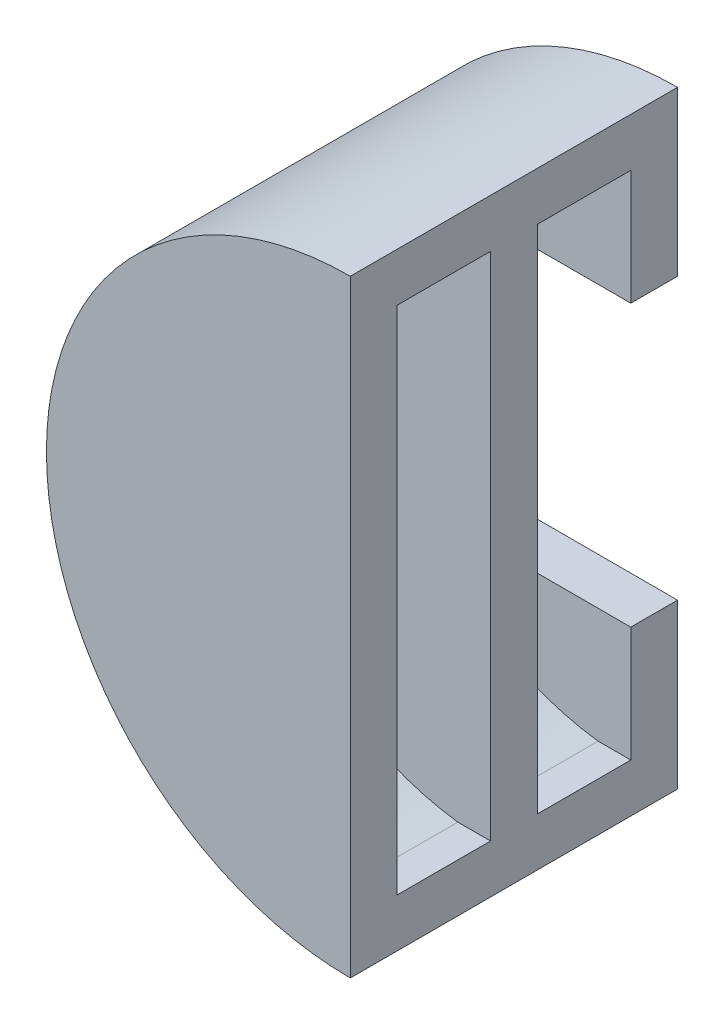
ISO-10303-21;
HEADER;
FILE_DESCRIPTION(('STEP AP214'),'2;1');
FILE_NAME('part.step','',(''),(''),'','','');
FILE_SCHEMA(('AUTOMOTIVE_DESIGN { 1 0 10303 214 1 1 1 1 }'));
ENDSEC;
DATA;
#1=APPLICATION_CONTEXT('core data for automotive mechanical design processes');
#2=APPLICATION_PROTOCOL_DEFINITION('international standard','automotive_design',2000,#1);
#3=PRODUCT_CONTEXT('',#1,'mechanical');
#4=PRODUCT('Part','Part','',(#3));
#5=PRODUCT_RELATED_PRODUCT_CATEGORY('part','',(#4));
#6=PRODUCT_DEFINITION_FORMATION('','',#4);
#7=PRODUCT_DEFINITION_CONTEXT('part definition',#1,'design');
#8=PRODUCT_DEFINITION('design','',#6,#7);
#9=PRODUCT_DEFINITION_SHAPE('','',#8);
#10=(LENGTH_UNIT() NAMED_UNIT(*) SI_UNIT(.MILLI.,.METRE.));
#11=(NAMED_UNIT(*) PLANE_ANGLE_UNIT() SI_UNIT($,.RADIAN.));
#12=(NAMED_UNIT(*) SI_UNIT($,.STERADIAN.) SOLID_ANGLE_UNIT());
#13=UNCERTAINTY_MEASURE_WITH_UNIT(LENGTH_MEASURE(1.E-05),#10,'distance_accuracy_value','');
#14=(GEOMETRIC_REPRESENTATION_CONTEXT(3) GLOBAL_UNCERTAINTY_ASSIGNED_CONTEXT((#13)) GLOBAL_UNIT_ASSIGNED_CONTEXT((#10,
#11,#12)) REPRESENTATION_CONTEXT('',''));
#15=CARTESIAN_POINT('',(0.,0.,0.));
#16=DIRECTION('',(0.,0.,1.));
#17=DIRECTION('',(1.,0.,0.));
#18=AXIS2_PLACEMENT_3D('',#15,#16,#17);
#19=CARTESIAN_POINT('',(0.,0.,35.));
#20=DIRECTION('',(0.,0.,-1.));
#21=DIRECTION('',(-1.,0.,0.));
#22=AXIS2_PLACEMENT_3D('',#19,#20,#21);
#23=CYLINDRICAL_SURFACE('',#22,32.5);
#24=CARTESIAN_POINT('',(0.,0.,0.));
#25=DIRECTION('',(0.,0.,-1.));
#26=DIRECTION('',(-1.,0.,0.));
#27=AXIS2_PLACEMENT_3D('',#24,#25,#26);
#28=CIRCLE('',#27,32.5);
#29=CARTESIAN_POINT('',(0.,-32.5,0.));
#30=VERTEX_POINT('',#29);
#31=CARTESIAN_POINT('',(0.,32.5,0.));
#32=VERTEX_POINT('',#31);
#33=EDGE_CURVE('E168',#30,#32,#28,.T.);
#34=ORIENTED_EDGE('',*,*,#33,.F.);
#35=DIRECTION('',(0.,0.,-1.));
#36=VECTOR('',#35,1.);
#37=CARTESIAN_POINT('',(0.,-32.5,100.094162564703));
#38=LINE('',#37,#36);
#39=CARTESIAN_POINT('',(0.,-32.5,35.));
#40=VERTEX_POINT('',#39);
#41=EDGE_CURVE('E213',#40,#30,#38,.T.);
#42=ORIENTED_EDGE('',*,*,#41,.F.);
#43=CARTESIAN_POINT('',(0.,0.,35.));
#44=DIRECTION('',(0.,0.,1.));
#45=DIRECTION('',(1.,0.,0.));
#46=AXIS2_PLACEMENT_3D('',#43,#44,#45);
#47=CIRCLE('',#46,32.5);
#48=CARTESIAN_POINT('',(0.,32.5,35.));
#49=VERTEX_POINT('',#48);
#50=EDGE_CURVE('E11',#49,#40,#47,.T.);
#51=ORIENTED_EDGE('',*,*,#50,.F.);
#52=DIRECTION('',(0.,0.,-1.));
#53=VECTOR('',#52,1.);
#54=CARTESIAN_POINT('',(0.,32.5,100.094162564703));
#55=LINE('',#54,#53);
#56=EDGE_CURVE('E205',#49,#32,#55,.T.);
#57=ORIENTED_EDGE('',*,*,#56,.T.);
#58=EDGE_LOOP('',(#34,#42,#51,#57));
#59=FACE_BOUND('',#58,.T.);
#60=ADVANCED_FACE('F34',(#59),#23,.T.);
#61=CARTESIAN_POINT('',(0.,32.5,100.094162564703));
#62=DIRECTION('',(-1.,0.,0.));
#63=DIRECTION('',(0.,0.,1.));
#64=AXIS2_PLACEMENT_3D('',#61,#62,#63);
#65=PLANE('',#64);
#66=DIRECTION('',(0.,0.,-1.));
#67=VECTOR('',#66,1.);
#68=CARTESIAN_POINT('',(0.,-27.310988842807,100.094162564703));
#69=LINE('',#68,#67);
#70=CARTESIAN_POINT('',(0.,-27.310988842807,30.));
#71=VERTEX_POINT('',#70);
#72=CARTESIAN_POINT('',(0.,-27.310988842807,20.));
#73=VERTEX_POINT('',#72);
#74=EDGE_CURVE('E203',#71,#73,#69,.T.);
#75=ORIENTED_EDGE('',*,*,#74,.F.);
#76=DIRECTION('',(0.,-1.,0.));
#77=VECTOR('',#76,1.);
#78=CARTESIAN_POINT('',(0.,32.5,30.));
#79=LINE('',#78,#77);
#80=CARTESIAN_POINT('',(0.,27.310988842807,30.));
#81=VERTEX_POINT('',#80);
#82=EDGE_CURVE('E196',#81,#71,#79,.T.);
#83=ORIENTED_EDGE('',*,*,#82,.F.);
#84=DIRECTION('',(0.,0.,1.));
#85=VECTOR('',#84,1.);
#86=CARTESIAN_POINT('',(0.,27.310988842807,100.094162564703));
#87=LINE('',#86,#85);
#88=CARTESIAN_POINT('',(0.,27.310988842807,20.));
#89=VERTEX_POINT('',#88);
#90=EDGE_CURVE('E198',#89,#81,#87,.T.);
#91=ORIENTED_EDGE('',*,*,#90,.F.);
#92=DIRECTION('',(0.,1.,0.));
#93=VECTOR('',#92,1.);
#94=CARTESIAN_POINT('',(0.,32.5,20.));
#95=LINE('',#94,#93);
#96=EDGE_CURVE('E201',#73,#89,#95,.T.);
#97=ORIENTED_EDGE('',*,*,#96,.F.);
#98=EDGE_LOOP('',(#75,#83,#91,#97));
#99=FACE_BOUND('',#98,.T.);
#100=DIRECTION('',(0.,1.,0.));
#101=VECTOR('',#100,1.);
#102=CARTESIAN_POINT('',(0.,32.5,5.));
#103=LINE('',#102,#101);
#104=CARTESIAN_POINT('',(0.,15.,5.));
#105=VERTEX_POINT('',#104);
#106=CARTESIAN_POINT('',(0.,27.310988842807,5.));
#107=VERTEX_POINT('',#106);
#108=EDGE_CURVE('E180',#105,#107,#103,.T.);
#109=ORIENTED_EDGE('',*,*,#108,.F.);
#110=DIRECTION('',(0.,0.,-1.));
#111=VECTOR('',#110,1.);
#112=CARTESIAN_POINT('',(0.,15.,8.));
#113=LINE('',#112,#111);
#114=CARTESIAN_POINT('',(0.,15.,0.));
#115=VERTEX_POINT('',#114);
#116=EDGE_CURVE('E157',#105,#115,#113,.T.);
#117=ORIENTED_EDGE('',*,*,#116,.T.);
#118=DIRECTION('',(0.,1.,0.));
#119=VECTOR('',#118,1.);
#120=CARTESIAN_POINT('',(0.,32.5,0.));
#121=LINE('',#120,#119);
#122=EDGE_CURVE('E209',#115,#32,#121,.T.);
#123=ORIENTED_EDGE('',*,*,#122,.T.);
#124=ORIENTED_EDGE('',*,*,#56,.F.);
#125=DIRECTION('',(0.,1.,0.));
#126=VECTOR('',#125,1.);
#127=CARTESIAN_POINT('',(0.,32.5,35.));
#128=LINE('',#127,#126);
#129=EDGE_CURVE('E208',#40,#49,#128,.T.);
#130=ORIENTED_EDGE('',*,*,#129,.F.);
#131=ORIENTED_EDGE('',*,*,#41,.T.);
#132=CARTESIAN_POINT('',(0.,-15.,0.));
#133=VERTEX_POINT('',#132);
#134=EDGE_CURVE('E206',#30,#133,#121,.T.);
#135=ORIENTED_EDGE('',*,*,#134,.T.);
#136=DIRECTION('',(0.,0.,-1.));
#137=VECTOR('',#136,1.);
#138=CARTESIAN_POINT('',(0.,-15.,8.));
#139=LINE('',#138,#137);
#140=CARTESIAN_POINT('',(0.,-15.,5.));
#141=VERTEX_POINT('',#140);
#142=EDGE_CURVE('E48',#141,#133,#139,.T.);
#143=ORIENTED_EDGE('',*,*,#142,.F.);
#144=CARTESIAN_POINT('',(0.,-27.310988842807,5.00000000000001));
#145=VERTEX_POINT('',#144);
#146=EDGE_CURVE('E188',#145,#141,#103,.T.);
#147=ORIENTED_EDGE('',*,*,#146,.F.);
#148=DIRECTION('',(0.,0.,-1.));
#149=VECTOR('',#148,1.);
#150=CARTESIAN_POINT('',(0.,-27.310988842807,100.094162564703));
#151=LINE('',#150,#149);
#152=CARTESIAN_POINT('',(0.,-27.310988842807,15.));
#153=VERTEX_POINT('',#152);
#154=EDGE_CURVE('E190',#153,#145,#151,.T.);
#155=ORIENTED_EDGE('',*,*,#154,.F.);
#156=DIRECTION('',(0.,-1.,0.));
#157=VECTOR('',#156,1.);
#158=CARTESIAN_POINT('',(0.,32.5,15.));
#159=LINE('',#158,#157);
#160=CARTESIAN_POINT('',(0.,27.310988842807,15.));
#161=VERTEX_POINT('',#160);
#162=EDGE_CURVE('E192',#161,#153,#159,.T.);
#163=ORIENTED_EDGE('',*,*,#162,.F.);
#164=DIRECTION('',(0.,0.,1.));
#165=VECTOR('',#164,1.);
#166=CARTESIAN_POINT('',(0.,27.310988842807,100.094162564703));
#167=LINE('',#166,#165);
#168=EDGE_CURVE('E194',#107,#161,#167,.T.);
#169=ORIENTED_EDGE('',*,*,#168,.F.);
#170=EDGE_LOOP('',(#109,#117,#123,#124,#130,#131,#135,#143,#147,#155,#163,#169));
#171=FACE_BOUND('',#170,.T.);
#172=ADVANCED_FACE('F251',(#99,#171),#65,.F.);
#173=CARTESIAN_POINT('',(0.,0.,35.));
#174=DIRECTION('',(0.,0.,1.));
#175=DIRECTION('',(1.,0.,0.));
#176=AXIS2_PLACEMENT_3D('',#173,#174,#175);
#177=PLANE('',#176);
#178=ORIENTED_EDGE('',*,*,#50,.T.);
#179=ORIENTED_EDGE('',*,*,#129,.T.);
#180=EDGE_LOOP('',(#178,#179));
#181=FACE_BOUND('',#180,.T.);
#182=ADVANCED_FACE('F266',(#181),#177,.T.);
#183=CARTESIAN_POINT('',(8.,27.310988842807,5.));
#184=DIRECTION('',(0.,-1.,0.));
#185=DIRECTION('',(0.,0.,-1.));
#186=AXIS2_PLACEMENT_3D('',#183,#184,#185);
#187=PLANE('',#186);
#188=ORIENTED_EDGE('',*,*,#168,.T.);
#189=DIRECTION('',(-1.,0.,0.));
#190=VECTOR('',#189,1.);
#191=CARTESIAN_POINT('',(8.,27.310988842807,15.));
#192=LINE('',#191,#190);
#193=CARTESIAN_POINT('',(-3.5,27.310988842807,15.));
#194=VERTEX_POINT('',#193);
#195=EDGE_CURVE('E178',#161,#194,#192,.T.);
#196=ORIENTED_EDGE('',*,*,#195,.T.);
#197=DIRECTION('',(0.,0.,-1.));
#198=VECTOR('',#197,1.);
#199=CARTESIAN_POINT('',(-3.5,27.310988842807,15.));
#200=LINE('',#199,#198);
#201=CARTESIAN_POINT('',(-3.5,27.310988842807,5.));
#202=VERTEX_POINT('',#201);
#203=EDGE_CURVE('E233',#194,#202,#200,.T.);
#204=ORIENTED_EDGE('',*,*,#203,.T.);
#205=DIRECTION('',(-1.,0.,0.));
#206=VECTOR('',#205,1.);
#207=CARTESIAN_POINT('',(8.,27.310988842807,5.));
#208=LINE('',#207,#206);
#209=EDGE_CURVE('E172',#107,#202,#208,.T.);
#210=ORIENTED_EDGE('',*,*,#209,.F.);
#211=EDGE_LOOP('',(#188,#196,#204,#210));
#212=FACE_BOUND('',#211,.T.);
#213=ADVANCED_FACE('F241',(#212),#187,.T.);
#214=CARTESIAN_POINT('',(8.,-27.310988842807,15.));
#215=DIRECTION('',(0.,1.,0.));
#216=DIRECTION('',(0.,0.,1.));
#217=AXIS2_PLACEMENT_3D('',#214,#215,#216);
#218=PLANE('',#217);
#219=ORIENTED_EDGE('',*,*,#154,.T.);
#220=DIRECTION('',(-1.,0.,0.));
#221=VECTOR('',#220,1.);
#222=CARTESIAN_POINT('',(8.,-27.310988842807,5.));
#223=LINE('',#222,#221);
#224=CARTESIAN_POINT('',(-3.5,-27.310988842807,5.));
#225=VERTEX_POINT('',#224);
#226=EDGE_CURVE('E56',#145,#225,#223,.T.);
#227=ORIENTED_EDGE('',*,*,#226,.T.);
#228=DIRECTION('',(0.,0.,-1.));
#229=VECTOR('',#228,1.);
#230=CARTESIAN_POINT('',(-3.49999999999999,-27.310988842807,15.));
#231=LINE('',#230,#229);
#232=CARTESIAN_POINT('',(-3.5,-27.310988842807,15.));
#233=VERTEX_POINT('',#232);
#234=EDGE_CURVE('E41',#233,#225,#231,.T.);
#235=ORIENTED_EDGE('',*,*,#234,.F.);
#236=DIRECTION('',(-1.,0.,0.));
#237=VECTOR('',#236,1.);
#238=CARTESIAN_POINT('',(8.,-27.310988842807,15.));
#239=LINE('',#238,#237);
#240=EDGE_CURVE('E176',#153,#233,#239,.T.);
#241=ORIENTED_EDGE('',*,*,#240,.F.);
#242=EDGE_LOOP('',(#219,#227,#235,#241));
#243=FACE_BOUND('',#242,.T.);
#244=ADVANCED_FACE('F258',(#243),#218,.T.);
#245=CARTESIAN_POINT('',(8.,-27.310988842807,30.));
#246=DIRECTION('',(0.,1.,0.));
#247=DIRECTION('',(0.,0.,1.));
#248=AXIS2_PLACEMENT_3D('',#245,#246,#247);
#249=PLANE('',#248);
#250=ORIENTED_EDGE('',*,*,#74,.T.);
#251=DIRECTION('',(-1.,0.,0.));
#252=VECTOR('',#251,1.);
#253=CARTESIAN_POINT('',(8.,-27.310988842807,20.));
#254=LINE('',#253,#252);
#255=CARTESIAN_POINT('',(-3.5,-27.310988842807,20.));
#256=VERTEX_POINT('',#255);
#257=EDGE_CURVE('E171',#73,#256,#254,.T.);
#258=ORIENTED_EDGE('',*,*,#257,.T.);
#259=DIRECTION('',(0.,0.,-1.));
#260=VECTOR('',#259,1.);
#261=CARTESIAN_POINT('',(-3.49999999999999,-27.310988842807,30.));
#262=LINE('',#261,#260);
#263=CARTESIAN_POINT('',(-3.49999999999999,-27.310988842807,30.));
#264=VERTEX_POINT('',#263);
#265=EDGE_CURVE('E221',#264,#256,#262,.T.);
#266=ORIENTED_EDGE('',*,*,#265,.F.);
#267=DIRECTION('',(-1.,0.,0.));
#268=VECTOR('',#267,1.);
#269=CARTESIAN_POINT('',(8.,-27.310988842807,30.));
#270=LINE('',#269,#268);
#271=EDGE_CURVE('E174',#71,#264,#270,.T.);
#272=ORIENTED_EDGE('',*,*,#271,.F.);
#273=EDGE_LOOP('',(#250,#258,#266,#272));
#274=FACE_BOUND('',#273,.T.);
#275=ADVANCED_FACE('F341',(#274),#249,.T.);
#276=CARTESIAN_POINT('',(8.,27.310988842807,20.));
#277=DIRECTION('',(0.,-1.,0.));
#278=DIRECTION('',(0.,0.,-1.));
#279=AXIS2_PLACEMENT_3D('',#276,#277,#278);
#280=PLANE('',#279);
#281=ORIENTED_EDGE('',*,*,#90,.T.);
#282=DIRECTION('',(-1.,0.,0.));
#283=VECTOR('',#282,1.);
#284=CARTESIAN_POINT('',(8.,27.310988842807,30.));
#285=LINE('',#284,#283);
#286=CARTESIAN_POINT('',(-3.5,27.310988842807,30.));
#287=VERTEX_POINT('',#286);
#288=EDGE_CURVE('E184',#81,#287,#285,.T.);
#289=ORIENTED_EDGE('',*,*,#288,.T.);
#290=DIRECTION('',(0.,0.,-1.));
#291=VECTOR('',#290,1.);
#292=CARTESIAN_POINT('',(-3.49999999999999,27.310988842807,30.));
#293=LINE('',#292,#291);
#294=CARTESIAN_POINT('',(-3.5,27.310988842807,20.));
#295=VERTEX_POINT('',#294);
#296=EDGE_CURVE('E224',#287,#295,#293,.T.);
#297=ORIENTED_EDGE('',*,*,#296,.T.);
#298=DIRECTION('',(-1.,0.,0.));
#299=VECTOR('',#298,1.);
#300=CARTESIAN_POINT('',(8.,27.310988842807,20.));
#301=LINE('',#300,#299);
#302=EDGE_CURVE('E182',#89,#295,#301,.T.);
#303=ORIENTED_EDGE('',*,*,#302,.F.);
#304=EDGE_LOOP('',(#281,#289,#297,#303));
#305=FACE_BOUND('',#304,.T.);
#306=ADVANCED_FACE('F345',(#305),#280,.T.);
#307=CARTESIAN_POINT('',(0.,0.,15.));
#308=DIRECTION('',(0.,0.,-1.));
#309=DIRECTION('',(-1.,0.,0.));
#310=AXIS2_PLACEMENT_3D('',#307,#308,#309);
#311=PLANE('',#310);
#312=CARTESIAN_POINT('',(0.,0.,15.));
#313=DIRECTION('',(0.,0.,-1.));
#314=DIRECTION('',(-1.,0.,0.));
#315=AXIS2_PLACEMENT_3D('',#312,#313,#314);
#316=CIRCLE('',#315,27.5343442190282);
#317=EDGE_CURVE('E230',#233,#194,#316,.T.);
#318=ORIENTED_EDGE('',*,*,#317,.T.);
#319=ORIENTED_EDGE('',*,*,#195,.F.);
#320=ORIENTED_EDGE('',*,*,#162,.T.);
#321=ORIENTED_EDGE('',*,*,#240,.T.);
#322=EDGE_LOOP('',(#318,#319,#320,#321));
#323=FACE_BOUND('',#322,.T.);
#324=ADVANCED_FACE('F255',(#323),#311,.T.);
#325=CARTESIAN_POINT('',(0.,0.,5.));
#326=DIRECTION('',(0.,0.,-1.));
#327=DIRECTION('',(-1.,0.,0.));
#328=AXIS2_PLACEMENT_3D('',#325,#326,#327);
#329=PLANE('',#328);
#330=DIRECTION('',(0.,1.,0.));
#331=VECTOR('',#330,1.);
#332=CARTESIAN_POINT('',(-22.08,0.,5.));
#333=LINE('',#332,#331);
#334=CARTESIAN_POINT('',(-22.08,-15.,5.));
#335=VERTEX_POINT('',#334);
#336=CARTESIAN_POINT('',(-22.08,15.,5.));
#337=VERTEX_POINT('',#336);
#338=EDGE_CURVE('E142',#335,#337,#333,.T.);
#339=ORIENTED_EDGE('',*,*,#338,.T.);
#340=DIRECTION('',(1.,0.,0.));
#341=VECTOR('',#340,1.);
#342=CARTESIAN_POINT('',(0.,15.,5.));
#343=LINE('',#342,#341);
#344=EDGE_CURVE('E165',#337,#105,#343,.T.);
#345=ORIENTED_EDGE('',*,*,#344,.T.);
#346=ORIENTED_EDGE('',*,*,#108,.T.);
#347=ORIENTED_EDGE('',*,*,#209,.T.);
#348=CARTESIAN_POINT('',(0.,0.,5.));
#349=DIRECTION('',(0.,0.,-1.));
#350=DIRECTION('',(-1.,0.,0.));
#351=AXIS2_PLACEMENT_3D('',#348,#349,#350);
#352=CIRCLE('',#351,27.5343442190282);
#353=EDGE_CURVE('E227',#225,#202,#352,.T.);
#354=ORIENTED_EDGE('',*,*,#353,.F.);
#355=ORIENTED_EDGE('',*,*,#226,.F.);
#356=ORIENTED_EDGE('',*,*,#146,.T.);
#357=DIRECTION('',(-1.,0.,0.));
#358=VECTOR('',#357,1.);
#359=CARTESIAN_POINT('',(0.,-15.,5.));
#360=LINE('',#359,#358);
#361=EDGE_CURVE('E160',#141,#335,#360,.T.);
#362=ORIENTED_EDGE('',*,*,#361,.T.);
#363=EDGE_LOOP('',(#339,#345,#346,#347,#354,#355,#356,#362));
#364=FACE_BOUND('',#363,.T.);
#365=ADVANCED_FACE('F248',(#364),#329,.F.);
#366=CARTESIAN_POINT('',(0.,0.,15.));
#367=DIRECTION('',(0.,0.,-1.));
#368=DIRECTION('',(-1.,0.,0.));
#369=AXIS2_PLACEMENT_3D('',#366,#367,#368);
#370=CYLINDRICAL_SURFACE('',#369,27.5343442190282);
#371=ORIENTED_EDGE('',*,*,#353,.T.);
#372=ORIENTED_EDGE('',*,*,#203,.F.);
#373=ORIENTED_EDGE('',*,*,#317,.F.);
#374=ORIENTED_EDGE('',*,*,#234,.T.);
#375=EDGE_LOOP('',(#371,#372,#373,#374));
#376=FACE_BOUND('',#375,.T.);
#377=ADVANCED_FACE('F246',(#376),#370,.F.);
#378=CARTESIAN_POINT('',(0.,0.,30.));
#379=DIRECTION('',(0.,0.,-1.));
#380=DIRECTION('',(-1.,0.,0.));
#381=AXIS2_PLACEMENT_3D('',#378,#379,#380);
#382=PLANE('',#381);
#383=CARTESIAN_POINT('',(0.,0.,30.));
#384=DIRECTION('',(0.,0.,-1.));
#385=DIRECTION('',(-1.,0.,0.));
#386=AXIS2_PLACEMENT_3D('',#383,#384,#385);
#387=CIRCLE('',#386,27.5343442190282);
#388=EDGE_CURVE('E218',#264,#287,#387,.T.);
#389=ORIENTED_EDGE('',*,*,#388,.T.);
#390=ORIENTED_EDGE('',*,*,#288,.F.);
#391=ORIENTED_EDGE('',*,*,#82,.T.);
#392=ORIENTED_EDGE('',*,*,#271,.T.);
#393=EDGE_LOOP('',(#389,#390,#391,#392));
#394=FACE_BOUND('',#393,.T.);
#395=ADVANCED_FACE('F350',(#394),#382,.T.);
#396=CARTESIAN_POINT('',(0.,0.,20.));
#397=DIRECTION('',(0.,0.,-1.));
#398=DIRECTION('',(-1.,0.,0.));
#399=AXIS2_PLACEMENT_3D('',#396,#397,#398);
#400=PLANE('',#399);
#401=CARTESIAN_POINT('',(0.,0.,20.));
#402=DIRECTION('',(0.,0.,-1.));
#403=DIRECTION('',(-1.,0.,0.));
#404=AXIS2_PLACEMENT_3D('',#401,#402,#403);
#405=CIRCLE('',#404,27.5343442190282);
#406=EDGE_CURVE('E212',#256,#295,#405,.T.);
#407=ORIENTED_EDGE('',*,*,#406,.F.);
#408=ORIENTED_EDGE('',*,*,#257,.F.);
#409=ORIENTED_EDGE('',*,*,#96,.T.);
#410=ORIENTED_EDGE('',*,*,#302,.T.);
#411=EDGE_LOOP('',(#407,#408,#409,#410));
#412=FACE_BOUND('',#411,.T.);
#413=ADVANCED_FACE('F353',(#412),#400,.F.);
#414=CARTESIAN_POINT('',(0.,0.,30.));
#415=DIRECTION('',(0.,0.,-1.));
#416=DIRECTION('',(-1.,0.,0.));
#417=AXIS2_PLACEMENT_3D('',#414,#415,#416);
#418=CYLINDRICAL_SURFACE('',#417,27.5343442190282);
#419=ORIENTED_EDGE('',*,*,#406,.T.);
#420=ORIENTED_EDGE('',*,*,#296,.F.);
#421=ORIENTED_EDGE('',*,*,#388,.F.);
#422=ORIENTED_EDGE('',*,*,#265,.T.);
#423=EDGE_LOOP('',(#419,#420,#421,#422));
#424=FACE_BOUND('',#423,.T.);
#425=ADVANCED_FACE('F309',(#424),#418,.F.);
#426=CARTESIAN_POINT('',(0.,0.,0.));
#427=DIRECTION('',(0.,0.,-1.));
#428=DIRECTION('',(-1.,0.,0.));
#429=AXIS2_PLACEMENT_3D('',#426,#427,#428);
#430=PLANE('',#429);
#431=DIRECTION('',(1.,0.,0.));
#432=VECTOR('',#431,1.);
#433=CARTESIAN_POINT('',(0.,15.,0.));
#434=LINE('',#433,#432);
#435=CARTESIAN_POINT('',(-22.08,15.,0.));
#436=VERTEX_POINT('',#435);
#437=EDGE_CURVE('E153',#436,#115,#434,.T.);
#438=ORIENTED_EDGE('',*,*,#437,.F.);
#439=DIRECTION('',(0.,1.,0.));
#440=VECTOR('',#439,1.);
#441=CARTESIAN_POINT('',(-22.08,15.,0.));
#442=LINE('',#441,#440);
#443=CARTESIAN_POINT('',(-22.08,-15.,0.));
#444=VERTEX_POINT('',#443);
#445=EDGE_CURVE('E139',#444,#436,#442,.T.);
#446=ORIENTED_EDGE('',*,*,#445,.F.);
#447=DIRECTION('',(-1.,0.,0.));
#448=VECTOR('',#447,1.);
#449=CARTESIAN_POINT('',(-22.08,-15.,0.));
#450=LINE('',#449,#448);
#451=EDGE_CURVE('E146',#133,#444,#450,.T.);
#452=ORIENTED_EDGE('',*,*,#451,.F.);
#453=ORIENTED_EDGE('',*,*,#134,.F.);
#454=ORIENTED_EDGE('',*,*,#33,.T.);
#455=ORIENTED_EDGE('',*,*,#122,.F.);
#456=EDGE_LOOP('',(#438,#446,#452,#453,#454,#455));
#457=FACE_BOUND('',#456,.T.);
#458=ADVANCED_FACE('F151',(#457),#430,.T.);
#459=CARTESIAN_POINT('',(0.,15.,8.));
#460=DIRECTION('',(0.,1.,0.));
#461=DIRECTION('',(0.,0.,1.));
#462=AXIS2_PLACEMENT_3D('',#459,#460,#461);
#463=PLANE('',#462);
#464=DIRECTION('',(0.,0.,-1.));
#465=VECTOR('',#464,1.);
#466=CARTESIAN_POINT('',(-22.08,15.,8.));
#467=LINE('',#466,#465);
#468=EDGE_CURVE('E144',#337,#436,#467,.T.);
#469=ORIENTED_EDGE('',*,*,#468,.T.);
#470=ORIENTED_EDGE('',*,*,#437,.T.);
#471=ORIENTED_EDGE('',*,*,#116,.F.);
#472=ORIENTED_EDGE('',*,*,#344,.F.);
#473=EDGE_LOOP('',(#469,#470,#471,#472));
#474=FACE_BOUND('',#473,.T.);
#475=ADVANCED_FACE('F308',(#474),#463,.F.);
#476=CARTESIAN_POINT('',(-22.08,15.,8.));
#477=DIRECTION('',(-1.,0.,0.));
#478=DIRECTION('',(0.,0.,1.));
#479=AXIS2_PLACEMENT_3D('',#476,#477,#478);
#480=PLANE('',#479);
#481=DIRECTION('',(0.,0.,-1.));
#482=VECTOR('',#481,1.);
#483=CARTESIAN_POINT('',(-22.08,-15.,8.));
#484=LINE('',#483,#482);
#485=EDGE_CURVE('E135',#335,#444,#484,.T.);
#486=ORIENTED_EDGE('',*,*,#485,.T.);
#487=ORIENTED_EDGE('',*,*,#445,.T.);
#488=ORIENTED_EDGE('',*,*,#468,.F.);
#489=ORIENTED_EDGE('',*,*,#338,.F.);
#490=EDGE_LOOP('',(#486,#487,#488,#489));
#491=FACE_BOUND('',#490,.T.);
#492=ADVANCED_FACE('F136',(#491),#480,.F.);
#493=CARTESIAN_POINT('',(-22.08,-15.,8.));
#494=DIRECTION('',(0.,-1.,0.));
#495=DIRECTION('',(0.,0.,-1.));
#496=AXIS2_PLACEMENT_3D('',#493,#494,#495);
#497=PLANE('',#496);
#498=ORIENTED_EDGE('',*,*,#142,.T.);
#499=ORIENTED_EDGE('',*,*,#451,.T.);
#500=ORIENTED_EDGE('',*,*,#485,.F.);
#501=ORIENTED_EDGE('',*,*,#361,.F.);
#502=EDGE_LOOP('',(#498,#499,#500,#501));
#503=FACE_BOUND('',#502,.T.);
#504=ADVANCED_FACE('F147',(#503),#497,.F.);
#505=CLOSED_SHELL('',(#60,#172,#182,#213,#244,#275,#306,#324,#365,#377,#395,#413,#425,#458,#475,
#492,#504));
#506=MANIFOLD_SOLID_BREP('B2',#505);
#507=ADVANCED_BREP_SHAPE_REPRESENTATION('',(#18,#506),#14);
#508=SHAPE_DEFINITION_REPRESENTATION(#9,#507);
ENDSEC;
END-ISO-10303-21;
